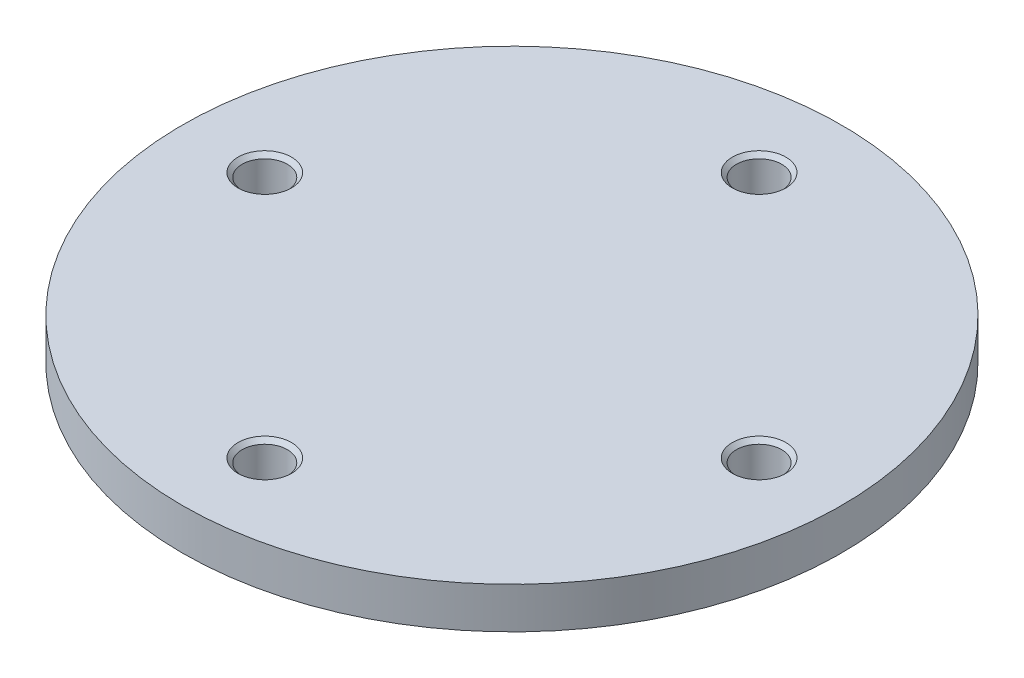
ISO-10303-21;
HEADER;
FILE_DESCRIPTION(('STEP AP214'),'2;1');
FILE_NAME('part.step','',(''),(''),'','','');
FILE_SCHEMA(('AUTOMOTIVE_DESIGN { 1 0 10303 214 1 1 1 1 }'));
ENDSEC;
DATA;
#1=APPLICATION_CONTEXT('core data for automotive mechanical design processes');
#2=APPLICATION_PROTOCOL_DEFINITION('international standard','automotive_design',2000,#1);
#3=PRODUCT_CONTEXT('',#1,'mechanical');
#4=PRODUCT('Part','Part','',(#3));
#5=PRODUCT_RELATED_PRODUCT_CATEGORY('part','',(#4));
#6=PRODUCT_DEFINITION_FORMATION('','',#4);
#7=PRODUCT_DEFINITION_CONTEXT('part definition',#1,'design');
#8=PRODUCT_DEFINITION('design','',#6,#7);
#9=PRODUCT_DEFINITION_SHAPE('','',#8);
#10=(LENGTH_UNIT() NAMED_UNIT(*) SI_UNIT(.MILLI.,.METRE.));
#11=(NAMED_UNIT(*) PLANE_ANGLE_UNIT() SI_UNIT($,.RADIAN.));
#12=(NAMED_UNIT(*) SI_UNIT($,.STERADIAN.) SOLID_ANGLE_UNIT());
#13=UNCERTAINTY_MEASURE_WITH_UNIT(LENGTH_MEASURE(1.E-05),#10,'distance_accuracy_value','');
#14=(GEOMETRIC_REPRESENTATION_CONTEXT(3) GLOBAL_UNCERTAINTY_ASSIGNED_CONTEXT((#13)) GLOBAL_UNIT_ASSIGNED_CONTEXT((#10,
#11,#12)) REPRESENTATION_CONTEXT('',''));
#15=CARTESIAN_POINT('',(0.,0.,0.));
#16=DIRECTION('',(0.,0.,1.));
#17=DIRECTION('',(1.,0.,0.));
#18=AXIS2_PLACEMENT_3D('',#15,#16,#17);
#19=CARTESIAN_POINT('',(0.,0.,0.));
#20=DIRECTION('',(0.,1.,0.));
#21=DIRECTION('',(0.,0.,1.));
#22=AXIS2_PLACEMENT_3D('',#19,#20,#21);
#23=PLANE('',#22);
#24=CARTESIAN_POINT('',(0.,0.,0.));
#25=DIRECTION('',(0.,1.,0.));
#26=DIRECTION('',(0.,0.,1.));
#27=AXIS2_PLACEMENT_3D('',#24,#25,#26);
#28=CIRCLE('',#27,10.);
#29=CARTESIAN_POINT('',(0.,0.,-10.));
#30=VERTEX_POINT('',#29);
#31=EDGE_CURVE('E100',#30,#30,#28,.T.);
#32=ORIENTED_EDGE('',*,*,#31,.F.);
#33=EDGE_LOOP('',(#32));
#34=FACE_BOUND('',#33,.T.);
#35=CARTESIAN_POINT('',(0.,0.,0.));
#36=DIRECTION('',(0.,1.,0.));
#37=DIRECTION('',(0.,0.,1.));
#38=AXIS2_PLACEMENT_3D('',#35,#36,#37);
#39=CIRCLE('',#38,2.5);
#40=CARTESIAN_POINT('',(-1.73493515728975,0.,-1.8));
#41=VERTEX_POINT('',#40);
#42=CARTESIAN_POINT('',(1.73493515728975,0.,-1.8));
#43=VERTEX_POINT('',#42);
#44=EDGE_CURVE('E77',#41,#43,#39,.T.);
#45=ORIENTED_EDGE('',*,*,#44,.T.);
#46=DIRECTION('',(-1.,0.,0.));
#47=VECTOR('',#46,1.);
#48=CARTESIAN_POINT('',(-1.73493515728975,0.,-1.8));
#49=LINE('',#48,#47);
#50=EDGE_CURVE('E87',#43,#41,#49,.T.);
#51=ORIENTED_EDGE('',*,*,#50,.T.);
#52=EDGE_LOOP('',(#45,#51));
#53=FACE_BOUND('',#52,.T.);
#54=ADVANCED_FACE('F47',(#34,#53),#23,.F.);
#55=CARTESIAN_POINT('',(0.,21.,0.));
#56=DIRECTION('',(0.,-1.,0.));
#57=DIRECTION('',(0.,0.,-1.));
#58=AXIS2_PLACEMENT_3D('',#55,#56,#57);
#59=CYLINDRICAL_SURFACE('',#58,10.);
#60=CARTESIAN_POINT('',(0.,11.0000000000001,0.));
#61=DIRECTION('',(0.,1.,0.));
#62=DIRECTION('',(0.,0.,1.));
#63=AXIS2_PLACEMENT_3D('',#60,#61,#62);
#64=CIRCLE('',#63,10.);
#65=CARTESIAN_POINT('',(0.,11.0000000000001,-10.));
#66=VERTEX_POINT('',#65);
#67=EDGE_CURVE('E112',#66,#66,#64,.F.);
#68=CARTESIAN_POINT('',(0.,11.0000000000001,-10.));
#69=CARTESIAN_POINT('',(0.,10.8854166666667,-10.));
#70=CARTESIAN_POINT('',(0.,10.7708333333334,-10.));
#71=CARTESIAN_POINT('',(0.,10.5416666666667,-10.));
#72=CARTESIAN_POINT('',(0.,10.4270833333334,-10.));
#73=CARTESIAN_POINT('',(0.,10.1979166666667,-10.));
#74=CARTESIAN_POINT('',(0.,10.0833333333334,-10.));
#75=CARTESIAN_POINT('',(0.,9.85416666666673,-10.));
#76=CARTESIAN_POINT('',(0.,9.7395833333334,-10.));
#77=CARTESIAN_POINT('',(0.,9.51041666666673,-10.));
#78=CARTESIAN_POINT('',(0.,9.3958333333334,-10.));
#79=CARTESIAN_POINT('',(0.,9.16666666666673,-10.));
#80=CARTESIAN_POINT('',(0.,9.05208333333339,-10.));
#81=CARTESIAN_POINT('',(0.,8.82291666666672,-10.));
#82=CARTESIAN_POINT('',(0.,8.70833333333339,-10.));
#83=CARTESIAN_POINT('',(0.,8.47916666666672,-10.));
#84=CARTESIAN_POINT('',(0.,8.36458333333339,-10.));
#85=CARTESIAN_POINT('',(0.,8.13541666666672,-10.));
#86=CARTESIAN_POINT('',(0.,8.02083333333339,-10.));
#87=CARTESIAN_POINT('',(0.,7.79166666666672,-10.));
#88=CARTESIAN_POINT('',(0.,7.67708333333338,-10.));
#89=CARTESIAN_POINT('',(0.,7.44791666666672,-10.));
#90=CARTESIAN_POINT('',(0.,7.33333333333338,-10.));
#91=CARTESIAN_POINT('',(0.,7.10416666666671,-10.));
#92=CARTESIAN_POINT('',(0.,6.98958333333338,-10.));
#93=CARTESIAN_POINT('',(0.,6.76041666666671,-10.));
#94=CARTESIAN_POINT('',(0.,6.64583333333338,-10.));
#95=CARTESIAN_POINT('',(0.,6.41666666666671,-10.));
#96=CARTESIAN_POINT('',(0.,6.30208333333338,-10.));
#97=CARTESIAN_POINT('',(0.,6.07291666666671,-10.));
#98=CARTESIAN_POINT('',(0.,5.95833333333337,-10.));
#99=CARTESIAN_POINT('',(0.,5.7291666666667,-10.));
#100=CARTESIAN_POINT('',(0.,5.61458333333337,-10.));
#101=CARTESIAN_POINT('',(0.,5.3854166666667,-10.));
#102=CARTESIAN_POINT('',(0.,5.27083333333337,-10.));
#103=CARTESIAN_POINT('',(0.,5.0416666666667,-10.));
#104=CARTESIAN_POINT('',(0.,4.92708333333337,-10.));
#105=CARTESIAN_POINT('',(0.,4.6979166666667,-10.));
#106=CARTESIAN_POINT('',(0.,4.58333333333337,-10.));
#107=CARTESIAN_POINT('',(0.,4.3541666666667,-10.));
#108=CARTESIAN_POINT('',(0.,4.23958333333336,-10.));
#109=CARTESIAN_POINT('',(0.,4.01041666666669,-10.));
#110=CARTESIAN_POINT('',(0.,3.89583333333336,-10.));
#111=CARTESIAN_POINT('',(0.,3.66666666666669,-10.));
#112=CARTESIAN_POINT('',(0.,3.55208333333336,-10.));
#113=CARTESIAN_POINT('',(0.,3.32291666666669,-10.));
#114=CARTESIAN_POINT('',(0.,3.20833333333335,-10.));
#115=CARTESIAN_POINT('',(0.,2.97916666666669,-10.));
#116=CARTESIAN_POINT('',(0.,2.86458333333335,-10.));
#117=CARTESIAN_POINT('',(0.,2.63541666666669,-10.));
#118=CARTESIAN_POINT('',(0.,2.52083333333335,-10.));
#119=CARTESIAN_POINT('',(0.,2.29166666666668,-10.));
#120=CARTESIAN_POINT('',(0.,2.17708333333335,-10.));
#121=CARTESIAN_POINT('',(0.,1.94791666666668,-10.));
#122=CARTESIAN_POINT('',(0.,1.83333333333335,-10.));
#123=CARTESIAN_POINT('',(0.,1.60416666666668,-10.));
#124=CARTESIAN_POINT('',(0.,1.48958333333334,-10.));
#125=CARTESIAN_POINT('',(0.,1.26041666666667,-10.));
#126=CARTESIAN_POINT('',(0.,1.14583333333334,-10.));
#127=CARTESIAN_POINT('',(0.,0.916666666666673,-10.));
#128=CARTESIAN_POINT('',(0.,0.802083333333339,-10.));
#129=CARTESIAN_POINT('',(0.,0.572916666666671,-10.));
#130=CARTESIAN_POINT('',(0.,0.458333333333337,-10.));
#131=CARTESIAN_POINT('',(0.,0.229166666666669,-10.));
#132=CARTESIAN_POINT('',(0.,0.114583333333335,-10.));
#133=CARTESIAN_POINT('',(0.,0.,-10.));
#134=B_SPLINE_CURVE_WITH_KNOTS('',3,(#68,#69,#70,#71,#72,#73,#74,#75,#76,#77,#78,#79,#80,#81,
#82,#83,#84,#85,#86,#87,#88,#89,#90,#91,#92,#93,#94,#95,#96,#97,#98,#99,#100,#101,#102,#103,
#104,#105,#106,#107,#108,#109,#110,#111,#112,#113,#114,#115,#116,#117,#118,#119,#120,#121,#122,
#123,#124,#125,#126,#127,#128,#129,#130,#131,#132,#133),.UNSPECIFIED.,.F.,.F.,(4,2,2,2,2,2,2,2,
2,2,2,2,2,2,2,2,2,2,2,2,2,2,2,2,2,2,2,2,2,2,2,2,4),(0.,0.343750000000002,0.687500000000004,
1.03125000000001,1.37500000000001,1.71875000000001,2.06250000000001,2.40625000000002,
2.75000000000002,3.09375000000002,3.43750000000002,3.78125000000003,4.12500000000003,
4.46875000000003,4.81250000000003,5.15625000000004,5.50000000000004,5.84375000000004,
6.18750000000004,6.53125000000004,6.87500000000005,7.21875000000005,7.56250000000005,
7.90625000000005,8.25000000000005,8.59375000000006,8.93750000000006,9.28125000000006,
9.62500000000007,9.96875000000007,10.3125000000001,10.6562500000001,11.0000000000001),.UNSPECIFIED.);
#135=EDGE_CURVE('BSEAM163',#66,#30,#134,.T.);
#136=ORIENTED_EDGE('',*,*,#67,.T.);
#137=ORIENTED_EDGE('',*,*,#31,.T.);
#138=ORIENTED_EDGE('',*,*,#135,.T.);
#139=ORIENTED_EDGE('',*,*,#135,.F.);
#140=EDGE_LOOP('',(#136,#138,#137,#139));
#141=FACE_BOUND('',#140,.T.);
#142=ADVANCED_FACE('F163',(#141),#59,.T.);
#143=CARTESIAN_POINT('',(0.,21.,0.));
#144=DIRECTION('',(0.,-1.,0.));
#145=DIRECTION('',(0.,0.,-1.));
#146=AXIS2_PLACEMENT_3D('',#143,#144,#145);
#147=CYLINDRICAL_SURFACE('',#146,2.5);
#148=ORIENTED_EDGE('',*,*,#44,.F.);
#149=DIRECTION('',(0.,-1.,0.));
#150=VECTOR('',#149,1.);
#151=CARTESIAN_POINT('',(-1.73493515728975,21.,-1.8));
#152=LINE('',#151,#150);
#153=CARTESIAN_POINT('',(-1.73493515728975,21.,-1.8));
#154=VERTEX_POINT('',#153);
#155=EDGE_CURVE('E91',#154,#41,#152,.T.);
#156=ORIENTED_EDGE('',*,*,#155,.F.);
#157=CARTESIAN_POINT('',(0.,21.,0.));
#158=DIRECTION('',(0.,1.,0.));
#159=DIRECTION('',(0.,0.,1.));
#160=AXIS2_PLACEMENT_3D('',#157,#158,#159);
#161=CIRCLE('',#160,2.5);
#162=CARTESIAN_POINT('',(1.73493515728975,21.,-1.8));
#163=VERTEX_POINT('',#162);
#164=EDGE_CURVE('E84',#154,#163,#161,.T.);
#165=ORIENTED_EDGE('',*,*,#164,.T.);
#166=DIRECTION('',(0.,-1.,0.));
#167=VECTOR('',#166,1.);
#168=CARTESIAN_POINT('',(1.73493515728975,21.,-1.8));
#169=LINE('',#168,#167);
#170=EDGE_CURVE('E93',#163,#43,#169,.T.);
#171=ORIENTED_EDGE('',*,*,#170,.T.);
#172=EDGE_LOOP('',(#148,#156,#165,#171));
#173=FACE_BOUND('',#172,.T.);
#174=ADVANCED_FACE('F96',(#173),#147,.F.);
#175=CARTESIAN_POINT('',(-1.73493515728975,21.,-1.8));
#176=DIRECTION('',(0.,0.,1.));
#177=DIRECTION('',(1.,0.,0.));
#178=AXIS2_PLACEMENT_3D('',#175,#176,#177);
#179=PLANE('',#178);
#180=CARTESIAN_POINT('',(0.,16.5,-1.8));
#181=DIRECTION('',(0.,0.,1.));
#182=DIRECTION('',(1.,0.,0.));
#183=AXIS2_PLACEMENT_3D('',#180,#181,#182);
#184=CIRCLE('',#183,1.5);
#185=CARTESIAN_POINT('',(1.5,16.5,-1.8));
#186=VERTEX_POINT('',#185);
#187=EDGE_CURVE('E225',#186,#186,#184,.T.);
#188=ORIENTED_EDGE('',*,*,#187,.F.);
#189=EDGE_LOOP('',(#188));
#190=FACE_BOUND('',#189,.T.);
#191=ORIENTED_EDGE('',*,*,#50,.F.);
#192=ORIENTED_EDGE('',*,*,#170,.F.);
#193=DIRECTION('',(-1.,0.,0.));
#194=VECTOR('',#193,1.);
#195=CARTESIAN_POINT('',(-1.73493515728975,21.,-1.8));
#196=LINE('',#195,#194);
#197=EDGE_CURVE('E69',#163,#154,#196,.T.);
#198=ORIENTED_EDGE('',*,*,#197,.T.);
#199=ORIENTED_EDGE('',*,*,#155,.T.);
#200=EDGE_LOOP('',(#191,#192,#198,#199));
#201=FACE_BOUND('',#200,.T.);
#202=ADVANCED_FACE('F90',(#190,#201),#179,.T.);
#203=CARTESIAN_POINT('',(0.,21.,0.));
#204=DIRECTION('',(0.,1.,0.));
#205=DIRECTION('',(0.,0.,1.));
#206=AXIS2_PLACEMENT_3D('',#203,#204,#205);
#207=PLANE('',#206);
#208=ORIENTED_EDGE('',*,*,#197,.F.);
#209=ORIENTED_EDGE('',*,*,#164,.F.);
#210=EDGE_LOOP('',(#208,#209));
#211=FACE_BOUND('',#210,.T.);
#212=ADVANCED_FACE('F85',(#211),#207,.F.);
#213=CARTESIAN_POINT('',(0.,26.,0.));
#214=DIRECTION('',(0.,-1.,0.));
#215=DIRECTION('',(0.,0.,-1.));
#216=AXIS2_PLACEMENT_3D('',#213,#214,#215);
#217=CYLINDRICAL_SURFACE('',#216,40.);
#218=CARTESIAN_POINT('',(0.,26.,0.));
#219=DIRECTION('',(0.,1.,0.));
#220=DIRECTION('',(0.,0.,1.));
#221=AXIS2_PLACEMENT_3D('',#218,#219,#220);
#222=CIRCLE('',#221,40.);
#223=CARTESIAN_POINT('',(0.,26.,40.));
#224=VERTEX_POINT('',#223);
#225=EDGE_CURVE('E229',#224,#224,#222,.T.);
#226=ORIENTED_EDGE('',*,*,#225,.F.);
#227=EDGE_LOOP('',(#226));
#228=FACE_BOUND('',#227,.T.);
#229=CARTESIAN_POINT('',(0.,21.,0.));
#230=DIRECTION('',(0.,1.,0.));
#231=DIRECTION('',(0.,0.,1.));
#232=AXIS2_PLACEMENT_3D('',#229,#230,#231);
#233=CIRCLE('',#232,40.);
#234=CARTESIAN_POINT('',(0.,21.,40.));
#235=VERTEX_POINT('',#234);
#236=EDGE_CURVE('E233',#235,#235,#233,.T.);
#237=ORIENTED_EDGE('',*,*,#236,.T.);
#238=EDGE_LOOP('',(#237));
#239=FACE_BOUND('',#238,.T.);
#240=ADVANCED_FACE('F266',(#228,#239),#217,.T.);
#241=CARTESIAN_POINT('',(0.,26.,0.));
#242=DIRECTION('',(0.,1.,0.));
#243=DIRECTION('',(0.,0.,1.));
#244=AXIS2_PLACEMENT_3D('',#241,#242,#243);
#245=PLANE('',#244);
#246=CARTESIAN_POINT('',(-2.09488880330588E-13,26.,30.));
#247=DIRECTION('',(0.,1.,0.));
#248=DIRECTION('',(0.,0.,1.));
#249=AXIS2_PLACEMENT_3D('',#246,#247,#248);
#250=CIRCLE('',#249,3.25);
#251=CARTESIAN_POINT('',(-2.09488880330588E-13,26.,33.25));
#252=VERTEX_POINT('',#251);
#253=EDGE_CURVE('E132',#252,#252,#250,.F.);
#254=ORIENTED_EDGE('',*,*,#253,.T.);
#255=EDGE_LOOP('',(#254));
#256=FACE_BOUND('',#255,.T.);
#257=CARTESIAN_POINT('',(-30.,26.,-3.14233320495882E-13));
#258=DIRECTION('',(0.,1.,0.));
#259=DIRECTION('',(0.,0.,1.));
#260=AXIS2_PLACEMENT_3D('',#257,#258,#259);
#261=CIRCLE('',#260,3.25);
#262=CARTESIAN_POINT('',(-30.,26.,3.24999999999969));
#263=VERTEX_POINT('',#262);
#264=EDGE_CURVE('E128',#263,#263,#261,.F.);
#265=ORIENTED_EDGE('',*,*,#264,.T.);
#266=EDGE_LOOP('',(#265));
#267=FACE_BOUND('',#266,.T.);
#268=CARTESIAN_POINT('',(0.,26.,-30.));
#269=DIRECTION('',(0.,1.,0.));
#270=DIRECTION('',(0.,0.,1.));
#271=AXIS2_PLACEMENT_3D('',#268,#269,#270);
#272=CIRCLE('',#271,3.25);
#273=CARTESIAN_POINT('',(0.,26.,-26.75));
#274=VERTEX_POINT('',#273);
#275=EDGE_CURVE('E124',#274,#274,#272,.F.);
#276=ORIENTED_EDGE('',*,*,#275,.T.);
#277=EDGE_LOOP('',(#276));
#278=FACE_BOUND('',#277,.T.);
#279=CARTESIAN_POINT('',(30.,26.,1.04744440165294E-13));
#280=DIRECTION('',(0.,1.,0.));
#281=DIRECTION('',(0.,0.,1.));
#282=AXIS2_PLACEMENT_3D('',#279,#280,#281);
#283=CIRCLE('',#282,3.25);
#284=CARTESIAN_POINT('',(30.,26.,3.25000000000011));
#285=VERTEX_POINT('',#284);
#286=EDGE_CURVE('E120',#285,#285,#283,.F.);
#287=ORIENTED_EDGE('',*,*,#286,.T.);
#288=EDGE_LOOP('',(#287));
#289=FACE_BOUND('',#288,.T.);
#290=ORIENTED_EDGE('',*,*,#225,.T.);
#291=EDGE_LOOP('',(#290));
#292=FACE_BOUND('',#291,.T.);
#293=ADVANCED_FACE('F263',(#256,#267,#278,#289,#292),#245,.T.);
#294=CARTESIAN_POINT('',(0.,21.,-30.));
#295=DIRECTION('',(0.,1.,0.));
#296=DIRECTION('',(0.,0.,1.));
#297=AXIS2_PLACEMENT_3D('',#294,#295,#296);
#298=CIRCLE('',#297,2.75);
#299=CARTESIAN_POINT('',(0.,21.,-27.25));
#300=VERTEX_POINT('',#299);
#301=EDGE_CURVE('E222',#300,#300,#298,.T.);
#302=ORIENTED_EDGE('',*,*,#301,.T.);
#303=EDGE_LOOP('',(#302));
#304=FACE_BOUND('',#303,.T.);
#305=CARTESIAN_POINT('',(30.,21.,1.04744440165294E-13));
#306=DIRECTION('',(0.,1.,0.));
#307=DIRECTION('',(0.,0.,1.));
#308=AXIS2_PLACEMENT_3D('',#305,#306,#307);
#309=CIRCLE('',#308,2.75);
#310=CARTESIAN_POINT('',(30.,21.,2.7500000000001));
#311=VERTEX_POINT('',#310);
#312=EDGE_CURVE('E216',#311,#311,#309,.T.);
#313=ORIENTED_EDGE('',*,*,#312,.T.);
#314=EDGE_LOOP('',(#313));
#315=FACE_BOUND('',#314,.T.);
#316=CARTESIAN_POINT('',(-2.09488880330588E-13,21.,30.));
#317=DIRECTION('',(0.,1.,0.));
#318=DIRECTION('',(0.,0.,1.));
#319=AXIS2_PLACEMENT_3D('',#316,#317,#318);
#320=CIRCLE('',#319,2.75);
#321=CARTESIAN_POINT('',(-2.09488880330588E-13,21.,32.75));
#322=VERTEX_POINT('',#321);
#323=EDGE_CURVE('E213',#322,#322,#320,.T.);
#324=ORIENTED_EDGE('',*,*,#323,.T.);
#325=EDGE_LOOP('',(#324));
#326=FACE_BOUND('',#325,.T.);
#327=CARTESIAN_POINT('',(-30.,21.,-3.14233320495882E-13));
#328=DIRECTION('',(0.,1.,0.));
#329=DIRECTION('',(0.,0.,1.));
#330=AXIS2_PLACEMENT_3D('',#327,#328,#329);
#331=CIRCLE('',#330,2.75);
#332=CARTESIAN_POINT('',(-30.,21.,2.74999999999969));
#333=VERTEX_POINT('',#332);
#334=EDGE_CURVE('E217',#333,#333,#331,.T.);
#335=ORIENTED_EDGE('',*,*,#334,.T.);
#336=EDGE_LOOP('',(#335));
#337=FACE_BOUND('',#336,.T.);
#338=CARTESIAN_POINT('',(0.,21.,0.));
#339=DIRECTION('',(0.,1.,0.));
#340=DIRECTION('',(0.,0.,1.));
#341=AXIS2_PLACEMENT_3D('',#338,#339,#340);
#342=CIRCLE('',#341,20.);
#343=CARTESIAN_POINT('',(0.,21.,20.));
#344=VERTEX_POINT('',#343);
#345=EDGE_CURVE('E108',#344,#344,#342,.T.);
#346=ORIENTED_EDGE('',*,*,#345,.T.);
#347=EDGE_LOOP('',(#346));
#348=FACE_BOUND('',#347,.T.);
#349=ORIENTED_EDGE('',*,*,#236,.F.);
#350=EDGE_LOOP('',(#349));
#351=FACE_BOUND('',#350,.T.);
#352=ADVANCED_FACE('F185',(#304,#315,#326,#337,#348,#351),#207,.F.);
#353=CARTESIAN_POINT('',(0.,21.,0.));
#354=DIRECTION('',(0.,1.,0.));
#355=DIRECTION('',(0.,0.,1.));
#356=AXIS2_PLACEMENT_3D('',#353,#354,#355);
#357=CONICAL_SURFACE('',#356,20.,0.785398163397454);
#358=CARTESIAN_POINT('',(-1.33196078503325,17.1898408999274,-16.1349567347077));
#359=CARTESIAN_POINT('',(-1.38665535830455,17.084251300512,-16.0244947818446));
#360=CARTESIAN_POINT('',(-1.42758175581722,16.9746087013012,-15.9107392062686));
#361=CARTESIAN_POINT('',(-1.48341163308897,16.750731095691,-15.680767606086));
#362=CARTESIAN_POINT('',(-1.49820138851107,16.6364782214963,-15.5645430450033));
#363=CARTESIAN_POINT('',(-1.50150647992193,16.4053996546521,-15.3320576570191));
#364=CARTESIAN_POINT('',(-1.48977790270917,16.2885599459739,-15.215806408044));
#365=CARTESIAN_POINT('',(-1.43793112088361,16.0568256414042,-14.9880169571556));
#366=CARTESIAN_POINT('',(-1.39789026612313,15.9419266172406,-14.8764667896189));
#367=CARTESIAN_POINT('',(-1.30525052117261,15.7562364361171,-14.6984249109563));
#368=CARTESIAN_POINT('',(-1.26134703788538,15.6835594145022,-14.6293534775993));
#369=CARTESIAN_POINT('',(-1.15862484594877,15.5433821755225,-14.4972297534826));
#370=CARTESIAN_POINT('',(-1.09982650874029,15.4758750502958,-14.4341694022985));
#371=CARTESIAN_POINT('',(-0.981504338900715,15.3634565651052,-14.3299630987278));
#372=CARTESIAN_POINT('',(-0.925109980488736,15.3168757282955,-14.2870763650097));
#373=CARTESIAN_POINT('',(-0.802860772397889,15.2307545765862,-14.20820944033));
#374=CARTESIAN_POINT('',(-0.737017791551302,15.1912055661967,-14.172220714997));
#375=CARTESIAN_POINT('',(-0.609139103284488,15.1277394796845,-14.1147137814061));
#376=CARTESIAN_POINT('',(-0.548513301249957,15.1022928771833,-14.0917599672115));
#377=CARTESIAN_POINT('',(-0.422391690290956,15.0591611028548,-14.0529523919809));
#378=CARTESIAN_POINT('',(-0.356898542343416,15.0414717261297,-14.037094784265));
#379=CARTESIAN_POINT('',(-0.222331183866218,15.0149771840811,-14.0133743454592));
#380=CARTESIAN_POINT('',(-0.153239838600112,15.0062195856555,-14.0055543174433));
#381=CARTESIAN_POINT('',(-0.0140782441906001,14.9984499380311,-13.9986153684422));
#382=CARTESIAN_POINT('',(0.0559917119657213,14.9994350318752,-13.9994938966835));
#383=CARTESIAN_POINT('',(0.188433901974202,15.0105326529502,-14.0094079286481));
#384=CARTESIAN_POINT('',(0.250934432507531,15.019821593058,-14.0177074262592));
#385=CARTESIAN_POINT('',(0.373069972397741,15.0457928659811,-14.0409691902079));
#386=CARTESIAN_POINT('',(0.432704807747676,15.0624756471284,-14.0559318605727));
#387=CARTESIAN_POINT('',(0.550020825632383,15.1030480864414,-14.0924425616862));
#388=CARTESIAN_POINT('',(0.607545227590678,15.127184224348,-14.1142162105048));
#389=CARTESIAN_POINT('',(0.717323941867519,15.1812137077616,-14.1631619418702));
#390=CARTESIAN_POINT('',(0.769575342994836,15.2111102073179,-14.1903369821731));
#391=CARTESIAN_POINT('',(0.891193468023971,15.2903736136423,-14.2627282632898));
#392=CARTESIAN_POINT('',(0.957347435078973,15.3423631608964,-14.3104865919343));
#393=CARTESIAN_POINT('',(1.07739480919839,15.4531359629456,-14.4130332793864));
#394=CARTESIAN_POINT('',(1.13126147502508,15.5119336232906,-14.467836572923));
#395=CARTESIAN_POINT('',(1.24406473498078,15.6554268031037,-14.602646633531));
#396=CARTESIAN_POINT('',(1.29814248699517,15.7419676200276,-14.6847472049732));
#397=CARTESIAN_POINT('',(1.38656132939383,15.9192398408077,-14.8547110401714));
#398=CARTESIAN_POINT('',(1.42087778060864,16.0099763244442,-14.9425813465231));
#399=CARTESIAN_POINT('',(1.47794403644238,16.2170733922536,-15.1451470847439));
#400=CARTESIAN_POINT('',(1.49532026257154,16.3339282385929,-15.2608470496027));
#401=CARTESIAN_POINT('',(1.5030406855882,16.5669170113426,-15.4941861759773));
#402=CARTESIAN_POINT('',(1.49334141940496,16.6830494783644,-15.6118281537039));
#403=CARTESIAN_POINT('',(1.4586340768401,16.8547161347589,-15.7874846182276));
#404=CARTESIAN_POINT('',(1.44359912895357,16.9117502338885,-15.846146756162));
#405=CARTESIAN_POINT('',(1.40657491199272,17.024469792258,-15.9626359539749));
#406=CARTESIAN_POINT('',(1.38458391358214,17.0801549124195,-16.0204628024507));
#407=CARTESIAN_POINT('',(1.33348133350454,17.1895384880786,-16.1345559890844));
#408=CARTESIAN_POINT('',(1.30438711598529,17.2432414260333,-16.1908257656487));
#409=CARTESIAN_POINT('',(1.23872397762252,17.3481686306589,-16.301213189331));
#410=CARTESIAN_POINT('',(1.20216068997875,17.3993947295722,-16.3553324218663));
#411=CARTESIAN_POINT('',(1.11522092964485,17.5058164463264,-16.4681760448761));
#412=CARTESIAN_POINT('',(1.06361149612371,17.560514687562,-16.5264344740653));
#413=CARTESIAN_POINT('',(0.949263470873528,17.6639705122102,-16.6370205809788));
#414=CARTESIAN_POINT('',(0.886541142746549,17.7127366037057,-16.6893567449044));
#415=CARTESIAN_POINT('',(0.764619727227642,17.7920576869281,-16.7747308142339));
#416=CARTESIAN_POINT('',(0.707701531668359,17.8242560838799,-16.8094780999398));
#417=CARTESIAN_POINT('',(0.586984172887498,17.8819938989433,-16.8718977163081));
#418=CARTESIAN_POINT('',(0.523194322801393,17.907542173334,-16.8995794555245));
#419=CARTESIAN_POINT('',(0.401747207604227,17.9463397756522,-16.9416668867034));
#420=CARTESIAN_POINT('',(0.345055875286252,17.9609757027502,-16.9575659689719));
#421=CARTESIAN_POINT('',(0.228848765906646,17.9836182378622,-16.9821760935715));
#422=CARTESIAN_POINT('',(0.169335051437497,17.9916296104971,-16.9908923020717));
#423=CARTESIAN_POINT('',(0.0489224789467233,18.0004204696183,-17.0004570727661));
#424=CARTESIAN_POINT('',(-0.0119804938982338,18.0011745774781,-17.0012780252744));
#425=CARTESIAN_POINT('',(-0.133006992526414,17.9953198125592,-16.994907193689));
#426=CARTESIAN_POINT('',(-0.19313037804167,17.9887096328527,-16.9877139873358));
#427=CARTESIAN_POINT('',(-0.307810976147031,17.9691724331449,-16.9664730923515));
#428=CARTESIAN_POINT('',(-0.362495871722487,17.9565823428147,-16.9527910627009));
#429=CARTESIAN_POINT('',(-0.468472282929214,17.9260365930106,-16.9196366312185));
#430=CARTESIAN_POINT('',(-0.519762739748148,17.9080792689045,-16.9001624329714));
#431=CARTESIAN_POINT('',(-0.639809449145703,17.8588555718662,-16.8468634489495));
#432=CARTESIAN_POINT('',(-0.706451208791045,17.8251983070973,-16.810481800962));
#433=CARTESIAN_POINT('',(-0.830951672220382,17.7509213543916,-16.7304216455691));
#434=CARTESIAN_POINT('',(-0.88878550977637,17.7102826196704,-16.6867231849935));
#435=CARTESIAN_POINT('',(-1.01830545791893,17.6057150657298,-16.5746549313528));
#436=CARTESIAN_POINT('',(-1.08557902654049,17.5391820339875,-16.5036415173668));
#437=CARTESIAN_POINT('',(-1.20387509213609,17.3994772548985,-16.3553553570888));
#438=CARTESIAN_POINT('',(-1.25491047444992,17.3263108308307,-16.278087635107));
#439=CARTESIAN_POINT('',(-1.3101723982392,17.2307461166535,-16.1777852669762));
#440=CARTESIAN_POINT('',(-1.32132681643201,17.2103701118335,-16.1564332518121));
#441=CARTESIAN_POINT('',(-1.33196078503325,17.1898408999274,-16.1349567347077));
#442=B_SPLINE_CURVE_WITH_KNOTS('',3,(#358,#359,#360,#361,#362,#363,#364,#365,#366,#367,#368,
#369,#370,#371,#372,#373,#374,#375,#376,#377,#378,#379,#380,#381,#382,#383,#384,#385,#386,#387,
#388,#389,#390,#391,#392,#393,#394,#395,#396,#397,#398,#399,#400,#401,#402,#403,#404,#405,#406,
#407,#408,#409,#410,#411,#412,#413,#414,#415,#416,#417,#418,#419,#420,#421,#422,#423,#424,#425,
#426,#427,#428,#429,#430,#431,#432,#433,#434,#435,#436,#437,#438,#439,#440,#441),.UNSPECIFIED.,
.T.,.F.,(4,2,2,2,2,2,2,2,2,2,2,2,2,2,2,2,2,2,2,2,2,2,2,2,2,2,2,2,2,2,2,2,2,2,2,2,2,2,2,2,2,4),
(0.,0.486845481210654,0.975804130211373,1.46927845213786,1.96140977306734,2.28874108437187,
2.61562710468382,2.86908926815212,3.12223578917683,3.33030378194195,3.53825884910513,
3.74731570407923,3.95631125682736,4.14662886669695,4.33695801821569,4.53441435234055,
4.73197911124829,5.0206110500792,5.30986527855375,5.70066505222879,6.0919510412994,
6.58558833241061,7.08001849274673,7.32933458407941,7.57871270639758,7.82748721122424,
8.07607477758937,8.36061439373318,8.64474097803345,8.86612131529984,9.08720530392986,
9.26845470529091,9.44957363181368,9.63132570132941,9.81311003122244,9.98568636537899,
10.1583162792345,10.4060826325368,10.6545359978216,11.0075441626967,11.3602715055451,
11.4549262263191),.UNSPECIFIED.);
#443=CARTESIAN_POINT('',(-1.33196078503325,17.1898408999274,-16.1349567347077));
#444=VERTEX_POINT('',#443);
#445=EDGE_CURVE('E52',#444,#444,#442,.T.);
#446=ORIENTED_EDGE('',*,*,#445,.T.);
#447=EDGE_LOOP('',(#446));
#448=FACE_BOUND('',#447,.T.);
#449=ORIENTED_EDGE('',*,*,#67,.F.);
#450=EDGE_LOOP('',(#449));
#451=FACE_BOUND('',#450,.T.);
#452=ORIENTED_EDGE('',*,*,#345,.F.);
#453=EDGE_LOOP('',(#452));
#454=FACE_BOUND('',#453,.T.);
#455=ADVANCED_FACE('F177',(#448,#451,#454),#357,.T.);
#456=CARTESIAN_POINT('',(-30.,21.,-3.14233320495882E-13));
#457=DIRECTION('',(0.,1.,0.));
#458=DIRECTION('',(0.,0.,1.));
#459=AXIS2_PLACEMENT_3D('',#456,#457,#458);
#460=CYLINDRICAL_SURFACE('',#459,2.75);
#461=CARTESIAN_POINT('',(-30.,25.5,-3.14233320495882E-13));
#462=DIRECTION('',(0.,1.,0.));
#463=DIRECTION('',(0.,0.,1.));
#464=AXIS2_PLACEMENT_3D('',#461,#462,#463);
#465=CIRCLE('',#464,2.75);
#466=CARTESIAN_POINT('',(-30.,25.5,2.74999999999969));
#467=VERTEX_POINT('',#466);
#468=EDGE_CURVE('E136',#467,#467,#465,.T.);
#469=ORIENTED_EDGE('',*,*,#468,.T.);
#470=EDGE_LOOP('',(#469));
#471=FACE_BOUND('',#470,.T.);
#472=ORIENTED_EDGE('',*,*,#334,.F.);
#473=EDGE_LOOP('',(#472));
#474=FACE_BOUND('',#473,.T.);
#475=ADVANCED_FACE('F184',(#471,#474),#460,.F.);
#476=CARTESIAN_POINT('',(-2.09488880330588E-13,21.,30.));
#477=DIRECTION('',(0.,1.,0.));
#478=DIRECTION('',(0.,0.,1.));
#479=AXIS2_PLACEMENT_3D('',#476,#477,#478);
#480=CYLINDRICAL_SURFACE('',#479,2.75);
#481=CARTESIAN_POINT('',(-2.09488880330588E-13,25.5,30.));
#482=DIRECTION('',(0.,1.,0.));
#483=DIRECTION('',(0.,0.,1.));
#484=AXIS2_PLACEMENT_3D('',#481,#482,#483);
#485=CIRCLE('',#484,2.75);
#486=CARTESIAN_POINT('',(-2.09488880330588E-13,25.5,32.75));
#487=VERTEX_POINT('',#486);
#488=EDGE_CURVE('E116',#487,#487,#485,.T.);
#489=ORIENTED_EDGE('',*,*,#488,.T.);
#490=EDGE_LOOP('',(#489));
#491=FACE_BOUND('',#490,.T.);
#492=ORIENTED_EDGE('',*,*,#323,.F.);
#493=EDGE_LOOP('',(#492));
#494=FACE_BOUND('',#493,.T.);
#495=ADVANCED_FACE('F207',(#491,#494),#480,.F.);
#496=CARTESIAN_POINT('',(30.,21.,1.04744440165294E-13));
#497=DIRECTION('',(0.,1.,0.));
#498=DIRECTION('',(0.,0.,1.));
#499=AXIS2_PLACEMENT_3D('',#496,#497,#498);
#500=CYLINDRICAL_SURFACE('',#499,2.75);
#501=CARTESIAN_POINT('',(30.,25.5,1.04744440165294E-13));
#502=DIRECTION('',(0.,1.,0.));
#503=DIRECTION('',(0.,0.,1.));
#504=AXIS2_PLACEMENT_3D('',#501,#502,#503);
#505=CIRCLE('',#504,2.75);
#506=CARTESIAN_POINT('',(30.,25.5,2.7500000000001));
#507=VERTEX_POINT('',#506);
#508=EDGE_CURVE('E11',#507,#507,#505,.T.);
#509=ORIENTED_EDGE('',*,*,#508,.T.);
#510=EDGE_LOOP('',(#509));
#511=FACE_BOUND('',#510,.T.);
#512=ORIENTED_EDGE('',*,*,#312,.F.);
#513=EDGE_LOOP('',(#512));
#514=FACE_BOUND('',#513,.T.);
#515=ADVANCED_FACE('F201',(#511,#514),#500,.F.);
#516=CARTESIAN_POINT('',(0.,21.,-30.));
#517=DIRECTION('',(0.,1.,0.));
#518=DIRECTION('',(0.,0.,1.));
#519=AXIS2_PLACEMENT_3D('',#516,#517,#518);
#520=CYLINDRICAL_SURFACE('',#519,2.75);
#521=CARTESIAN_POINT('',(0.,25.5,-30.));
#522=DIRECTION('',(0.,1.,0.));
#523=DIRECTION('',(0.,0.,1.));
#524=AXIS2_PLACEMENT_3D('',#521,#522,#523);
#525=CIRCLE('',#524,2.75);
#526=CARTESIAN_POINT('',(0.,25.5,-27.25));
#527=VERTEX_POINT('',#526);
#528=EDGE_CURVE('E63',#527,#527,#525,.T.);
#529=ORIENTED_EDGE('',*,*,#528,.T.);
#530=EDGE_LOOP('',(#529));
#531=FACE_BOUND('',#530,.T.);
#532=ORIENTED_EDGE('',*,*,#301,.F.);
#533=EDGE_LOOP('',(#532));
#534=FACE_BOUND('',#533,.T.);
#535=ADVANCED_FACE('F144',(#531,#534),#520,.F.);
#536=CARTESIAN_POINT('',(-2.09488880330588E-13,25.5,30.));
#537=DIRECTION('',(0.,1.,0.));
#538=DIRECTION('',(0.,0.,1.));
#539=AXIS2_PLACEMENT_3D('',#536,#537,#538);
#540=CONICAL_SURFACE('',#539,2.75,0.785398163397461);
#541=ORIENTED_EDGE('',*,*,#253,.F.);
#542=EDGE_LOOP('',(#541));
#543=FACE_BOUND('',#542,.T.);
#544=ORIENTED_EDGE('',*,*,#488,.F.);
#545=EDGE_LOOP('',(#544));
#546=FACE_BOUND('',#545,.T.);
#547=ADVANCED_FACE('F157',(#543,#546),#540,.F.);
#548=CARTESIAN_POINT('',(-30.,25.5,-3.14233320495882E-13));
#549=DIRECTION('',(0.,1.,0.));
#550=DIRECTION('',(0.,0.,1.));
#551=AXIS2_PLACEMENT_3D('',#548,#549,#550);
#552=CONICAL_SURFACE('',#551,2.75,0.785398163397462);
#553=ORIENTED_EDGE('',*,*,#264,.F.);
#554=EDGE_LOOP('',(#553));
#555=FACE_BOUND('',#554,.T.);
#556=ORIENTED_EDGE('',*,*,#468,.F.);
#557=EDGE_LOOP('',(#556));
#558=FACE_BOUND('',#557,.T.);
#559=ADVANCED_FACE('F149',(#555,#558),#552,.F.);
#560=CARTESIAN_POINT('',(0.,25.5,-30.));
#561=DIRECTION('',(0.,1.,0.));
#562=DIRECTION('',(0.,0.,1.));
#563=AXIS2_PLACEMENT_3D('',#560,#561,#562);
#564=CONICAL_SURFACE('',#563,2.75,0.785398163397462);
#565=ORIENTED_EDGE('',*,*,#275,.F.);
#566=EDGE_LOOP('',(#565));
#567=FACE_BOUND('',#566,.T.);
#568=ORIENTED_EDGE('',*,*,#528,.F.);
#569=EDGE_LOOP('',(#568));
#570=FACE_BOUND('',#569,.T.);
#571=ADVANCED_FACE('F147',(#567,#570),#564,.F.);
#572=CARTESIAN_POINT('',(30.,25.5,1.04744440165294E-13));
#573=DIRECTION('',(0.,1.,0.));
#574=DIRECTION('',(0.,0.,1.));
#575=AXIS2_PLACEMENT_3D('',#572,#573,#574);
#576=CONICAL_SURFACE('',#575,2.75,0.785398163397462);
#577=ORIENTED_EDGE('',*,*,#286,.F.);
#578=EDGE_LOOP('',(#577));
#579=FACE_BOUND('',#578,.T.);
#580=ORIENTED_EDGE('',*,*,#508,.F.);
#581=EDGE_LOOP('',(#580));
#582=FACE_BOUND('',#581,.T.);
#583=ADVANCED_FACE('F50',(#579,#582),#576,.F.);
#584=CARTESIAN_POINT('',(0.,16.5,-40.));
#585=DIRECTION('',(0.,0.,1.));
#586=DIRECTION('',(1.,0.,0.));
#587=AXIS2_PLACEMENT_3D('',#584,#585,#586);
#588=CYLINDRICAL_SURFACE('',#587,1.5);
#589=ORIENTED_EDGE('',*,*,#187,.T.);
#590=EDGE_LOOP('',(#589));
#591=FACE_BOUND('',#590,.T.);
#592=ORIENTED_EDGE('',*,*,#445,.F.);
#593=EDGE_LOOP('',(#592));
#594=FACE_BOUND('',#593,.T.);
#595=ADVANCED_FACE('F155',(#591,#594),#588,.F.);
#596=CLOSED_SHELL('',(#54,#142,#174,#202,#212,#240,#293,#352,#455,#475,#495,#515,#535,#547,#559,
#571,#583,#595));
#597=MANIFOLD_SOLID_BREP('B2',#596);
#598=ADVANCED_BREP_SHAPE_REPRESENTATION('',(#18,#597),#14);
#599=SHAPE_DEFINITION_REPRESENTATION(#9,#598);
ENDSEC;
END-ISO-10303-21;
